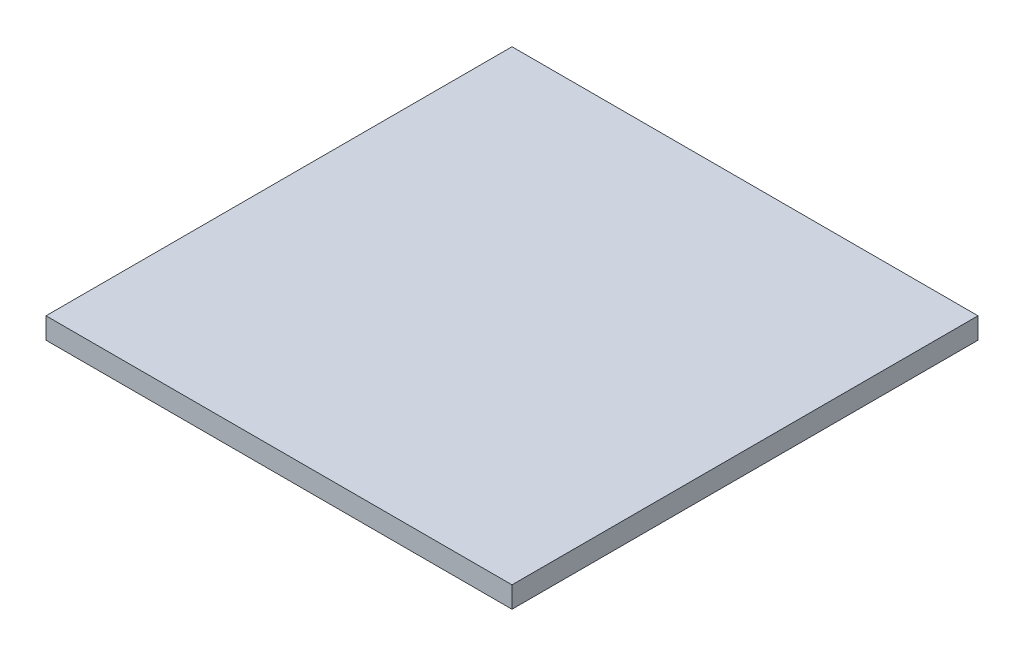
ISO-10303-21;
HEADER;
FILE_DESCRIPTION(('STEP AP214'),'2;1');
FILE_NAME('part.step','',(''),(''),'','','');
FILE_SCHEMA(('AUTOMOTIVE_DESIGN { 1 0 10303 214 1 1 1 1 }'));
ENDSEC;
DATA;
#1=APPLICATION_CONTEXT('core data for automotive mechanical design processes');
#2=APPLICATION_PROTOCOL_DEFINITION('international standard','automotive_design',2000,#1);
#3=PRODUCT_CONTEXT('',#1,'mechanical');
#4=PRODUCT('Part','Part','',(#3));
#5=PRODUCT_RELATED_PRODUCT_CATEGORY('part','',(#4));
#6=PRODUCT_DEFINITION_FORMATION('','',#4);
#7=PRODUCT_DEFINITION_CONTEXT('part definition',#1,'design');
#8=PRODUCT_DEFINITION('design','',#6,#7);
#9=PRODUCT_DEFINITION_SHAPE('','',#8);
#10=(LENGTH_UNIT() NAMED_UNIT(*) SI_UNIT(.MILLI.,.METRE.));
#11=(NAMED_UNIT(*) PLANE_ANGLE_UNIT() SI_UNIT($,.RADIAN.));
#12=(NAMED_UNIT(*) SI_UNIT($,.STERADIAN.) SOLID_ANGLE_UNIT());
#13=UNCERTAINTY_MEASURE_WITH_UNIT(LENGTH_MEASURE(1.E-05),#10,'distance_accuracy_value','');
#14=(GEOMETRIC_REPRESENTATION_CONTEXT(3) GLOBAL_UNCERTAINTY_ASSIGNED_CONTEXT((#13)) GLOBAL_UNIT_ASSIGNED_CONTEXT((#10,
#11,#12)) REPRESENTATION_CONTEXT('',''));
#15=CARTESIAN_POINT('',(0.,0.,0.));
#16=DIRECTION('',(0.,0.,1.));
#17=DIRECTION('',(1.,0.,0.));
#18=AXIS2_PLACEMENT_3D('',#15,#16,#17);
#19=CARTESIAN_POINT('',(27.5,2.,27.5));
#20=DIRECTION('',(-1.,0.,0.));
#21=DIRECTION('',(0.,0.,1.));
#22=AXIS2_PLACEMENT_3D('',#19,#20,#21);
#23=PLANE('',#22);
#24=DIRECTION('',(0.,-1.,0.));
#25=VECTOR('',#24,1.);
#26=CARTESIAN_POINT('',(27.5,2.,27.5));
#27=LINE('',#26,#25);
#28=CARTESIAN_POINT('',(27.5,2.,27.5));
#29=VERTEX_POINT('',#28);
#30=CARTESIAN_POINT('',(27.5,-0.5,27.5));
#31=VERTEX_POINT('',#30);
#32=EDGE_CURVE('E86',#29,#31,#27,.T.);
#33=ORIENTED_EDGE('',*,*,#32,.T.);
#34=DIRECTION('',(0.,0.,1.));
#35=VECTOR('',#34,1.);
#36=CARTESIAN_POINT('',(27.5,-0.5,-27.5));
#37=LINE('',#36,#35);
#38=CARTESIAN_POINT('',(27.5,-0.5,-27.5));
#39=VERTEX_POINT('',#38);
#40=EDGE_CURVE('E90',#39,#31,#37,.T.);
#41=ORIENTED_EDGE('',*,*,#40,.F.);
#42=DIRECTION('',(0.,-1.,0.));
#43=VECTOR('',#42,1.);
#44=CARTESIAN_POINT('',(27.5,2.,-27.5));
#45=LINE('',#44,#43);
#46=CARTESIAN_POINT('',(27.5,2.,-27.5));
#47=VERTEX_POINT('',#46);
#48=EDGE_CURVE('E53',#47,#39,#45,.T.);
#49=ORIENTED_EDGE('',*,*,#48,.F.);
#50=DIRECTION('',(0.,0.,-1.));
#51=VECTOR('',#50,1.);
#52=CARTESIAN_POINT('',(27.5,2.,27.5));
#53=LINE('',#52,#51);
#54=EDGE_CURVE('E91',#29,#47,#53,.T.);
#55=ORIENTED_EDGE('',*,*,#54,.F.);
#56=EDGE_LOOP('',(#33,#41,#49,#55));
#57=FACE_BOUND('',#56,.T.);
#58=ADVANCED_FACE('F45',(#57),#23,.F.);
#59=CARTESIAN_POINT('',(-27.5,2.,-27.5));
#60=DIRECTION('',(0.,0.,1.));
#61=DIRECTION('',(1.,0.,0.));
#62=AXIS2_PLACEMENT_3D('',#59,#60,#61);
#63=PLANE('',#62);
#64=ORIENTED_EDGE('',*,*,#48,.T.);
#65=DIRECTION('',(1.,0.,0.));
#66=VECTOR('',#65,1.);
#67=CARTESIAN_POINT('',(-27.5,-0.5,-27.5));
#68=LINE('',#67,#66);
#69=CARTESIAN_POINT('',(-27.5,-0.5,-27.5));
#70=VERTEX_POINT('',#69);
#71=EDGE_CURVE('E109',#70,#39,#68,.T.);
#72=ORIENTED_EDGE('',*,*,#71,.F.);
#73=DIRECTION('',(0.,-1.,0.));
#74=VECTOR('',#73,1.);
#75=CARTESIAN_POINT('',(-27.5,2.,-27.5));
#76=LINE('',#75,#74);
#77=CARTESIAN_POINT('',(-27.5,2.,-27.5));
#78=VERTEX_POINT('',#77);
#79=EDGE_CURVE('E132',#78,#70,#76,.T.);
#80=ORIENTED_EDGE('',*,*,#79,.F.);
#81=DIRECTION('',(-1.,0.,0.));
#82=VECTOR('',#81,1.);
#83=CARTESIAN_POINT('',(-27.5,2.,-27.5));
#84=LINE('',#83,#82);
#85=EDGE_CURVE('E123',#47,#78,#84,.T.);
#86=ORIENTED_EDGE('',*,*,#85,.F.);
#87=EDGE_LOOP('',(#64,#72,#80,#86));
#88=FACE_BOUND('',#87,.T.);
#89=ADVANCED_FACE('F136',(#88),#63,.F.);
#90=CARTESIAN_POINT('',(-27.5,2.,27.5));
#91=DIRECTION('',(1.,0.,0.));
#92=DIRECTION('',(0.,0.,-1.));
#93=AXIS2_PLACEMENT_3D('',#90,#91,#92);
#94=PLANE('',#93);
#95=ORIENTED_EDGE('',*,*,#79,.T.);
#96=DIRECTION('',(0.,0.,-1.));
#97=VECTOR('',#96,1.);
#98=CARTESIAN_POINT('',(-27.5,-0.5,-27.5));
#99=LINE('',#98,#97);
#100=CARTESIAN_POINT('',(-27.5,-0.5,27.5));
#101=VERTEX_POINT('',#100);
#102=EDGE_CURVE('E103',#101,#70,#99,.T.);
#103=ORIENTED_EDGE('',*,*,#102,.F.);
#104=DIRECTION('',(0.,-1.,0.));
#105=VECTOR('',#104,1.);
#106=CARTESIAN_POINT('',(-27.5,2.,27.5));
#107=LINE('',#106,#105);
#108=CARTESIAN_POINT('',(-27.5,2.,27.5));
#109=VERTEX_POINT('',#108);
#110=EDGE_CURVE('E94',#109,#101,#107,.T.);
#111=ORIENTED_EDGE('',*,*,#110,.F.);
#112=DIRECTION('',(0.,0.,1.));
#113=VECTOR('',#112,1.);
#114=CARTESIAN_POINT('',(-27.5,2.,27.5));
#115=LINE('',#114,#113);
#116=EDGE_CURVE('E65',#78,#109,#115,.T.);
#117=ORIENTED_EDGE('',*,*,#116,.F.);
#118=EDGE_LOOP('',(#95,#103,#111,#117));
#119=FACE_BOUND('',#118,.T.);
#120=ADVANCED_FACE('F147',(#119),#94,.F.);
#121=CARTESIAN_POINT('',(-27.5,2.,27.5));
#122=DIRECTION('',(0.,0.,-1.));
#123=DIRECTION('',(-1.,0.,0.));
#124=AXIS2_PLACEMENT_3D('',#121,#122,#123);
#125=PLANE('',#124);
#126=ORIENTED_EDGE('',*,*,#110,.T.);
#127=DIRECTION('',(-1.,0.,0.));
#128=VECTOR('',#127,1.);
#129=CARTESIAN_POINT('',(-27.5,-0.5,27.5));
#130=LINE('',#129,#128);
#131=EDGE_CURVE('E97',#31,#101,#130,.T.);
#132=ORIENTED_EDGE('',*,*,#131,.F.);
#133=ORIENTED_EDGE('',*,*,#32,.F.);
#134=DIRECTION('',(1.,0.,0.));
#135=VECTOR('',#134,1.);
#136=CARTESIAN_POINT('',(-27.5,2.,27.5));
#137=LINE('',#136,#135);
#138=EDGE_CURVE('E60',#109,#29,#137,.T.);
#139=ORIENTED_EDGE('',*,*,#138,.F.);
#140=EDGE_LOOP('',(#126,#132,#133,#139));
#141=FACE_BOUND('',#140,.T.);
#142=ADVANCED_FACE('F98',(#141),#125,.F.);
#143=CARTESIAN_POINT('',(0.,2.,0.));
#144=DIRECTION('',(0.,-1.,0.));
#145=DIRECTION('',(0.,0.,-1.));
#146=AXIS2_PLACEMENT_3D('',#143,#144,#145);
#147=PLANE('',#146);
#148=ORIENTED_EDGE('',*,*,#54,.T.);
#149=ORIENTED_EDGE('',*,*,#85,.T.);
#150=ORIENTED_EDGE('',*,*,#116,.T.);
#151=ORIENTED_EDGE('',*,*,#138,.T.);
#152=EDGE_LOOP('',(#148,#149,#150,#151));
#153=FACE_BOUND('',#152,.T.);
#154=ADVANCED_FACE('F138',(#153),#147,.F.);
#155=CARTESIAN_POINT('',(0.,-0.5,0.));
#156=DIRECTION('',(0.,1.,0.));
#157=DIRECTION('',(0.,0.,1.));
#158=AXIS2_PLACEMENT_3D('',#155,#156,#157);
#159=PLANE('',#158);
#160=ORIENTED_EDGE('',*,*,#40,.T.);
#161=ORIENTED_EDGE('',*,*,#131,.T.);
#162=ORIENTED_EDGE('',*,*,#102,.T.);
#163=ORIENTED_EDGE('',*,*,#71,.T.);
#164=EDGE_LOOP('',(#160,#161,#162,#163));
#165=FACE_BOUND('',#164,.T.);
#166=CARTESIAN_POINT('',(0.,-0.5,0.));
#167=DIRECTION('',(0.,-1.,0.));
#168=DIRECTION('',(0.,0.,-1.));
#169=AXIS2_PLACEMENT_3D('',#166,#167,#168);
#170=CIRCLE('',#169,25.);
#171=CARTESIAN_POINT('',(0.,-0.5,-25.));
#172=VERTEX_POINT('',#171);
#173=EDGE_CURVE('E111',#172,#172,#170,.T.);
#174=ORIENTED_EDGE('',*,*,#173,.F.);
#175=EDGE_LOOP('',(#174));
#176=FACE_BOUND('',#175,.T.);
#177=ADVANCED_FACE('F106',(#165,#176),#159,.F.);
#178=CARTESIAN_POINT('',(0.,-0.5,0.));
#179=DIRECTION('',(0.,1.,0.));
#180=DIRECTION('',(0.,0.,1.));
#181=AXIS2_PLACEMENT_3D('',#178,#179,#180);
#182=CYLINDRICAL_SURFACE('',#181,25.);
#183=ORIENTED_EDGE('',*,*,#173,.T.);
#184=EDGE_LOOP('',(#183));
#185=FACE_BOUND('',#184,.T.);
#186=CARTESIAN_POINT('',(0.,0.,0.));
#187=DIRECTION('',(0.,-1.,0.));
#188=DIRECTION('',(0.,0.,-1.));
#189=AXIS2_PLACEMENT_3D('',#186,#187,#188);
#190=CIRCLE('',#189,25.);
#191=CARTESIAN_POINT('',(0.,0.,-25.));
#192=VERTEX_POINT('',#191);
#193=EDGE_CURVE('E11',#192,#192,#190,.F.);
#194=ORIENTED_EDGE('',*,*,#193,.T.);
#195=EDGE_LOOP('',(#194));
#196=FACE_BOUND('',#195,.T.);
#197=ADVANCED_FACE('F145',(#185,#196),#182,.F.);
#198=CARTESIAN_POINT('',(0.,0.,0.));
#199=DIRECTION('',(0.,-1.,0.));
#200=DIRECTION('',(0.,0.,-1.));
#201=AXIS2_PLACEMENT_3D('',#198,#199,#200);
#202=PLANE('',#201);
#203=ORIENTED_EDGE('',*,*,#193,.F.);
#204=EDGE_LOOP('',(#203));
#205=FACE_BOUND('',#204,.T.);
#206=ADVANCED_FACE('F159',(#205),#202,.T.);
#207=CLOSED_SHELL('',(#58,#89,#120,#142,#154,#177,#197,#206));
#208=MANIFOLD_SOLID_BREP('B2',#207);
#209=ADVANCED_BREP_SHAPE_REPRESENTATION('',(#18,#208),#14);
#210=SHAPE_DEFINITION_REPRESENTATION(#9,#209);
ENDSEC;
END-ISO-10303-21;
